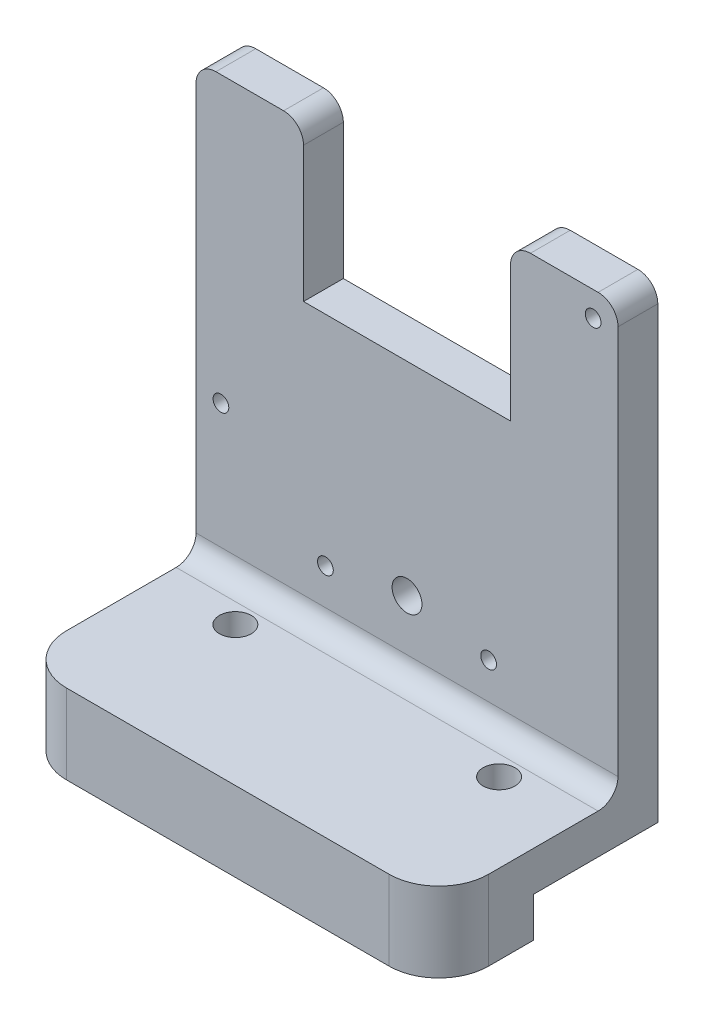
ISO-10303-21;
HEADER;
FILE_DESCRIPTION(('STEP AP214'),'2;1');
FILE_NAME('part.step','',(''),(''),'','','');
FILE_SCHEMA(('AUTOMOTIVE_DESIGN { 1 0 10303 214 1 1 1 1 }'));
ENDSEC;
DATA;
#1=APPLICATION_CONTEXT('core data for automotive mechanical design processes');
#2=APPLICATION_PROTOCOL_DEFINITION('international standard','automotive_design',2000,#1);
#3=PRODUCT_CONTEXT('',#1,'mechanical');
#4=PRODUCT('Part','Part','',(#3));
#5=PRODUCT_RELATED_PRODUCT_CATEGORY('part','',(#4));
#6=PRODUCT_DEFINITION_FORMATION('','',#4);
#7=PRODUCT_DEFINITION_CONTEXT('part definition',#1,'design');
#8=PRODUCT_DEFINITION('design','',#6,#7);
#9=PRODUCT_DEFINITION_SHAPE('','',#8);
#10=(LENGTH_UNIT() NAMED_UNIT(*) SI_UNIT(.MILLI.,.METRE.));
#11=(NAMED_UNIT(*) PLANE_ANGLE_UNIT() SI_UNIT($,.RADIAN.));
#12=(NAMED_UNIT(*) SI_UNIT($,.STERADIAN.) SOLID_ANGLE_UNIT());
#13=UNCERTAINTY_MEASURE_WITH_UNIT(LENGTH_MEASURE(1.E-05),#10,'distance_accuracy_value','');
#14=(GEOMETRIC_REPRESENTATION_CONTEXT(3) GLOBAL_UNCERTAINTY_ASSIGNED_CONTEXT((#13)) GLOBAL_UNIT_ASSIGNED_CONTEXT((#10,
#11,#12)) REPRESENTATION_CONTEXT('',''));
#15=CARTESIAN_POINT('',(0.,0.,0.));
#16=DIRECTION('',(0.,0.,1.));
#17=DIRECTION('',(1.,0.,0.));
#18=AXIS2_PLACEMENT_3D('',#15,#16,#17);
#19=CARTESIAN_POINT('',(26.924,25.4,0.));
#20=DIRECTION('',(0.,-1.,0.));
#21=DIRECTION('',(0.,0.,-1.));
#22=AXIS2_PLACEMENT_3D('',#19,#20,#21);
#23=PLANE('',#22);
#24=DIRECTION('',(-1.,0.,0.));
#25=VECTOR('',#24,1.);
#26=CARTESIAN_POINT('',(26.924,25.4,-5.08));
#27=LINE('',#26,#25);
#28=CARTESIAN_POINT('',(-15.748,25.4,-5.08));
#29=VERTEX_POINT('',#28);
#30=CARTESIAN_POINT('',(-24.384,25.4,-5.08));
#31=VERTEX_POINT('',#30);
#32=EDGE_CURVE('E257',#29,#31,#27,.T.);
#33=ORIENTED_EDGE('',*,*,#32,.T.);
#34=DIRECTION('',(0.,0.,1.));
#35=VECTOR('',#34,1.);
#36=CARTESIAN_POINT('',(-24.384,25.4,0.));
#37=LINE('',#36,#35);
#38=CARTESIAN_POINT('',(-24.384,25.4,0.));
#39=VERTEX_POINT('',#38);
#40=EDGE_CURVE('E333',#31,#39,#37,.T.);
#41=ORIENTED_EDGE('',*,*,#40,.T.);
#42=DIRECTION('',(-1.,0.,0.));
#43=VECTOR('',#42,1.);
#44=CARTESIAN_POINT('',(26.924,25.4,0.));
#45=LINE('',#44,#43);
#46=CARTESIAN_POINT('',(-15.748,25.4,0.));
#47=VERTEX_POINT('',#46);
#48=EDGE_CURVE('E241',#47,#39,#45,.T.);
#49=ORIENTED_EDGE('',*,*,#48,.F.);
#50=DIRECTION('',(0.,0.,1.));
#51=VECTOR('',#50,1.);
#52=CARTESIAN_POINT('',(-15.748,25.4,0.));
#53=LINE('',#52,#51);
#54=EDGE_CURVE('E331',#47,#29,#53,.F.);
#55=ORIENTED_EDGE('',*,*,#54,.T.);
#56=EDGE_LOOP('',(#33,#41,#49,#55));
#57=FACE_BOUND('',#56,.T.);
#58=ADVANCED_FACE('F34',(#57),#23,.F.);
#59=CARTESIAN_POINT('',(26.924,25.4,0.));
#60=DIRECTION('',(0.,0.,-1.));
#61=DIRECTION('',(0.,1.,0.));
#62=AXIS2_PLACEMENT_3D('',#59,#60,#61);
#63=PLANE('',#62);
#64=CARTESIAN_POINT('',(-23.749,-10.922,0.));
#65=DIRECTION('',(0.,0.,1.));
#66=DIRECTION('',(1.,0.,0.));
#67=AXIS2_PLACEMENT_3D('',#64,#65,#66);
#68=CIRCLE('',#67,1.0033);
#69=CARTESIAN_POINT('',(-22.7457,-10.922,0.));
#70=VERTEX_POINT('',#69);
#71=EDGE_CURVE('E206',#70,#70,#68,.T.);
#72=ORIENTED_EDGE('',*,*,#71,.F.);
#73=EDGE_LOOP('',(#72));
#74=FACE_BOUND('',#73,.T.);
#75=CARTESIAN_POINT('',(0.,-20.32,0.));
#76=DIRECTION('',(0.,0.,1.));
#77=DIRECTION('',(1.,0.,0.));
#78=AXIS2_PLACEMENT_3D('',#75,#76,#77);
#79=CIRCLE('',#78,1.905);
#80=CARTESIAN_POINT('',(1.905,-20.32,0.));
#81=VERTEX_POINT('',#80);
#82=EDGE_CURVE('E211',#81,#81,#79,.T.);
#83=ORIENTED_EDGE('',*,*,#82,.F.);
#84=EDGE_LOOP('',(#83));
#85=FACE_BOUND('',#84,.T.);
#86=CARTESIAN_POINT('',(10.414,-22.225,0.));
#87=DIRECTION('',(0.,0.,1.));
#88=DIRECTION('',(1.,0.,0.));
#89=AXIS2_PLACEMENT_3D('',#86,#87,#88);
#90=CIRCLE('',#89,1.0033);
#91=CARTESIAN_POINT('',(11.4173,-22.225,0.));
#92=VERTEX_POINT('',#91);
#93=EDGE_CURVE('E215',#92,#92,#90,.T.);
#94=ORIENTED_EDGE('',*,*,#93,.F.);
#95=EDGE_LOOP('',(#94));
#96=FACE_BOUND('',#95,.T.);
#97=CARTESIAN_POINT('',(-10.414,-22.225,0.));
#98=DIRECTION('',(0.,0.,1.));
#99=DIRECTION('',(1.,0.,0.));
#100=AXIS2_PLACEMENT_3D('',#97,#98,#99);
#101=CIRCLE('',#100,1.0033);
#102=CARTESIAN_POINT('',(-9.4107,-22.225,0.));
#103=VERTEX_POINT('',#102);
#104=EDGE_CURVE('E219',#103,#103,#101,.T.);
#105=ORIENTED_EDGE('',*,*,#104,.F.);
#106=EDGE_LOOP('',(#105));
#107=FACE_BOUND('',#106,.T.);
#108=CARTESIAN_POINT('',(23.749,22.225,0.));
#109=DIRECTION('',(0.,0.,1.));
#110=DIRECTION('',(1.,0.,0.));
#111=AXIS2_PLACEMENT_3D('',#108,#109,#110);
#112=CIRCLE('',#111,1.0033);
#113=CARTESIAN_POINT('',(24.7523,22.225,0.));
#114=VERTEX_POINT('',#113);
#115=EDGE_CURVE('E223',#114,#114,#112,.T.);
#116=ORIENTED_EDGE('',*,*,#115,.F.);
#117=EDGE_LOOP('',(#116));
#118=FACE_BOUND('',#117,.T.);
#119=DIRECTION('',(0.,-1.,0.));
#120=VECTOR('',#119,1.);
#121=CARTESIAN_POINT('',(-26.924,25.4,0.));
#122=LINE('',#121,#120);
#123=CARTESIAN_POINT('',(-26.924,22.86,0.));
#124=VERTEX_POINT('',#123);
#125=CARTESIAN_POINT('',(-26.924,-26.8478,0.));
#126=VERTEX_POINT('',#125);
#127=EDGE_CURVE('E242',#124,#126,#122,.T.);
#128=ORIENTED_EDGE('',*,*,#127,.T.);
#129=DIRECTION('',(-1.,0.,0.));
#130=VECTOR('',#129,1.);
#131=CARTESIAN_POINT('',(26.924,-26.8478,0.));
#132=LINE('',#131,#130);
#133=CARTESIAN_POINT('',(26.924,-26.8478,0.));
#134=VERTEX_POINT('',#133);
#135=EDGE_CURVE('E57',#126,#134,#132,.F.);
#136=ORIENTED_EDGE('',*,*,#135,.T.);
#137=DIRECTION('',(0.,-1.,0.));
#138=VECTOR('',#137,1.);
#139=CARTESIAN_POINT('',(26.924,25.4,0.));
#140=LINE('',#139,#138);
#141=CARTESIAN_POINT('',(26.924,22.86,0.));
#142=VERTEX_POINT('',#141);
#143=EDGE_CURVE('E227',#142,#134,#140,.T.);
#144=ORIENTED_EDGE('',*,*,#143,.F.);
#145=CARTESIAN_POINT('',(24.384,22.86,0.));
#146=DIRECTION('',(0.,0.,-1.));
#147=DIRECTION('',(0.,1.,0.));
#148=AXIS2_PLACEMENT_3D('',#145,#146,#147);
#149=CIRCLE('',#148,2.54);
#150=CARTESIAN_POINT('',(24.384,25.4,0.));
#151=VERTEX_POINT('',#150);
#152=EDGE_CURVE('E315',#142,#151,#149,.F.);
#153=ORIENTED_EDGE('',*,*,#152,.T.);
#154=CARTESIAN_POINT('',(15.748,25.4,0.));
#155=VERTEX_POINT('',#154);
#156=EDGE_CURVE('E254',#151,#155,#45,.T.);
#157=ORIENTED_EDGE('',*,*,#156,.T.);
#158=CARTESIAN_POINT('',(15.748,22.86,0.));
#159=DIRECTION('',(0.,0.,-1.));
#160=DIRECTION('',(0.,1.,0.));
#161=AXIS2_PLACEMENT_3D('',#158,#159,#160);
#162=CIRCLE('',#161,2.54);
#163=CARTESIAN_POINT('',(13.208,22.86,0.));
#164=VERTEX_POINT('',#163);
#165=EDGE_CURVE('E313',#155,#164,#162,.F.);
#166=ORIENTED_EDGE('',*,*,#165,.T.);
#167=DIRECTION('',(0.,1.,0.));
#168=VECTOR('',#167,1.);
#169=CARTESIAN_POINT('',(13.208,25.4,0.));
#170=LINE('',#169,#168);
#171=CARTESIAN_POINT('',(13.208,5.588,0.));
#172=VERTEX_POINT('',#171);
#173=EDGE_CURVE('E181',#172,#164,#170,.T.);
#174=ORIENTED_EDGE('',*,*,#173,.F.);
#175=DIRECTION('',(1.,0.,0.));
#176=VECTOR('',#175,1.);
#177=CARTESIAN_POINT('',(-13.208,5.588,0.));
#178=LINE('',#177,#176);
#179=CARTESIAN_POINT('',(-13.208,5.588,0.));
#180=VERTEX_POINT('',#179);
#181=EDGE_CURVE('E201',#180,#172,#178,.T.);
#182=ORIENTED_EDGE('',*,*,#181,.F.);
#183=DIRECTION('',(0.,-1.,0.));
#184=VECTOR('',#183,1.);
#185=CARTESIAN_POINT('',(-13.208,25.4,0.));
#186=LINE('',#185,#184);
#187=CARTESIAN_POINT('',(-13.208,22.86,0.));
#188=VERTEX_POINT('',#187);
#189=EDGE_CURVE('E187',#188,#180,#186,.T.);
#190=ORIENTED_EDGE('',*,*,#189,.F.);
#191=CARTESIAN_POINT('',(-15.748,22.86,0.));
#192=DIRECTION('',(0.,0.,-1.));
#193=DIRECTION('',(0.,1.,0.));
#194=AXIS2_PLACEMENT_3D('',#191,#192,#193);
#195=CIRCLE('',#194,2.54);
#196=EDGE_CURVE('E309',#188,#47,#195,.F.);
#197=ORIENTED_EDGE('',*,*,#196,.T.);
#198=ORIENTED_EDGE('',*,*,#48,.T.);
#199=CARTESIAN_POINT('',(-24.384,22.86,0.));
#200=DIRECTION('',(0.,0.,-1.));
#201=DIRECTION('',(0.,1.,0.));
#202=AXIS2_PLACEMENT_3D('',#199,#200,#201);
#203=CIRCLE('',#202,2.54);
#204=EDGE_CURVE('E311',#39,#124,#203,.F.);
#205=ORIENTED_EDGE('',*,*,#204,.T.);
#206=EDGE_LOOP('',(#128,#136,#144,#153,#157,#166,#174,#182,#190,#197,#198,#205));
#207=FACE_BOUND('',#206,.T.);
#208=ADVANCED_FACE('F364',(#74,#85,#96,#107,#118,#207),#63,.F.);
#209=CARTESIAN_POINT('',(26.924,-29.3878,0.));
#210=DIRECTION('',(0.,-1.,0.));
#211=DIRECTION('',(0.,0.,-1.));
#212=AXIS2_PLACEMENT_3D('',#209,#210,#211);
#213=PLANE('',#212);
#214=CARTESIAN_POINT('',(16.8275,-29.3878,5.07999999999999));
#215=DIRECTION('',(0.,1.,0.));
#216=DIRECTION('',(0.,0.,1.));
#217=AXIS2_PLACEMENT_3D('',#214,#215,#216);
#218=CIRCLE('',#217,2.032);
#219=CARTESIAN_POINT('',(16.8275,-29.3878,7.11199999999999));
#220=VERTEX_POINT('',#219);
#221=EDGE_CURVE('E352',#220,#220,#218,.T.);
#222=ORIENTED_EDGE('',*,*,#221,.F.);
#223=EDGE_LOOP('',(#222));
#224=FACE_BOUND('',#223,.T.);
#225=CARTESIAN_POINT('',(-16.8275,-29.3878,5.07999999999999));
#226=DIRECTION('',(0.,1.,0.));
#227=DIRECTION('',(0.,0.,1.));
#228=AXIS2_PLACEMENT_3D('',#225,#226,#227);
#229=CIRCLE('',#228,2.032);
#230=CARTESIAN_POINT('',(-16.8275,-29.3878,7.11199999999999));
#231=VERTEX_POINT('',#230);
#232=EDGE_CURVE('E345',#231,#231,#229,.T.);
#233=ORIENTED_EDGE('',*,*,#232,.F.);
#234=EDGE_LOOP('',(#233));
#235=FACE_BOUND('',#234,.T.);
#236=DIRECTION('',(0.,0.,1.));
#237=VECTOR('',#236,1.);
#238=CARTESIAN_POINT('',(26.924,-29.3878,0.));
#239=LINE('',#238,#237);
#240=CARTESIAN_POINT('',(26.924,-29.3878,2.53999999999999));
#241=VERTEX_POINT('',#240);
#242=CARTESIAN_POINT('',(26.924,-29.3878,16.51));
#243=VERTEX_POINT('',#242);
#244=EDGE_CURVE('E229',#241,#243,#239,.T.);
#245=ORIENTED_EDGE('',*,*,#244,.F.);
#246=DIRECTION('',(-1.,0.,0.));
#247=VECTOR('',#246,1.);
#248=CARTESIAN_POINT('',(-26.924,-29.3878,2.53999999999999));
#249=LINE('',#248,#247);
#250=CARTESIAN_POINT('',(-26.924,-29.3878,2.53999999999999));
#251=VERTEX_POINT('',#250);
#252=EDGE_CURVE('E340',#241,#251,#249,.T.);
#253=ORIENTED_EDGE('',*,*,#252,.T.);
#254=DIRECTION('',(0.,0.,1.));
#255=VECTOR('',#254,1.);
#256=CARTESIAN_POINT('',(-26.924,-29.3878,0.));
#257=LINE('',#256,#255);
#258=CARTESIAN_POINT('',(-26.924,-29.3878,16.51));
#259=VERTEX_POINT('',#258);
#260=EDGE_CURVE('E244',#251,#259,#257,.T.);
#261=ORIENTED_EDGE('',*,*,#260,.T.);
#262=CARTESIAN_POINT('',(-20.574,-29.3878,16.51));
#263=DIRECTION('',(0.,-1.,0.));
#264=DIRECTION('',(0.,0.,-1.));
#265=AXIS2_PLACEMENT_3D('',#262,#263,#264);
#266=CIRCLE('',#265,6.35);
#267=CARTESIAN_POINT('',(-20.574,-29.3878,22.86));
#268=VERTEX_POINT('',#267);
#269=EDGE_CURVE('E301',#259,#268,#266,.F.);
#270=ORIENTED_EDGE('',*,*,#269,.T.);
#271=DIRECTION('',(-1.,0.,0.));
#272=VECTOR('',#271,1.);
#273=CARTESIAN_POINT('',(26.924,-29.3878,22.86));
#274=LINE('',#273,#272);
#275=CARTESIAN_POINT('',(20.574,-29.3878,22.86));
#276=VERTEX_POINT('',#275);
#277=EDGE_CURVE('E273',#276,#268,#274,.T.);
#278=ORIENTED_EDGE('',*,*,#277,.F.);
#279=CARTESIAN_POINT('',(20.574,-29.3878,16.51));
#280=DIRECTION('',(0.,-1.,0.));
#281=DIRECTION('',(0.,0.,-1.));
#282=AXIS2_PLACEMENT_3D('',#279,#280,#281);
#283=CIRCLE('',#282,6.35);
#284=EDGE_CURVE('E298',#276,#243,#283,.F.);
#285=ORIENTED_EDGE('',*,*,#284,.T.);
#286=EDGE_LOOP('',(#245,#253,#261,#270,#278,#285));
#287=FACE_BOUND('',#286,.T.);
#288=ADVANCED_FACE('F360',(#224,#235,#287),#213,.F.);
#289=CARTESIAN_POINT('',(26.924,-29.3878,22.86));
#290=DIRECTION('',(0.,0.,-1.));
#291=DIRECTION('',(0.,1.,0.));
#292=AXIS2_PLACEMENT_3D('',#289,#290,#291);
#293=PLANE('',#292);
#294=ORIENTED_EDGE('',*,*,#277,.T.);
#295=DIRECTION('',(0.,-1.,0.));
#296=VECTOR('',#295,1.);
#297=CARTESIAN_POINT('',(-20.574,-39.5478,22.86));
#298=LINE('',#297,#296);
#299=CARTESIAN_POINT('',(-20.574,-39.5478,22.86));
#300=VERTEX_POINT('',#299);
#301=EDGE_CURVE('E288',#268,#300,#298,.T.);
#302=ORIENTED_EDGE('',*,*,#301,.T.);
#303=DIRECTION('',(-1.,0.,0.));
#304=VECTOR('',#303,1.);
#305=CARTESIAN_POINT('',(26.924,-39.5478,22.86));
#306=LINE('',#305,#304);
#307=CARTESIAN_POINT('',(20.574,-39.5478,22.86));
#308=VERTEX_POINT('',#307);
#309=EDGE_CURVE('E270',#308,#300,#306,.T.);
#310=ORIENTED_EDGE('',*,*,#309,.F.);
#311=DIRECTION('',(0.,-1.,0.));
#312=VECTOR('',#311,1.);
#313=CARTESIAN_POINT('',(20.574,-29.3878,22.86));
#314=LINE('',#313,#312);
#315=EDGE_CURVE('E276',#308,#276,#314,.F.);
#316=ORIENTED_EDGE('',*,*,#315,.T.);
#317=EDGE_LOOP('',(#294,#302,#310,#316));
#318=FACE_BOUND('',#317,.T.);
#319=ADVANCED_FACE('F363',(#318),#293,.F.);
#320=CARTESIAN_POINT('',(26.924,-39.5478,22.86));
#321=DIRECTION('',(0.,1.,0.));
#322=DIRECTION('',(0.,0.,1.));
#323=AXIS2_PLACEMENT_3D('',#320,#321,#322);
#324=PLANE('',#323);
#325=ORIENTED_EDGE('',*,*,#309,.T.);
#326=CARTESIAN_POINT('',(-20.574,-39.5478,16.51));
#327=DIRECTION('',(0.,1.,0.));
#328=DIRECTION('',(0.,0.,1.));
#329=AXIS2_PLACEMENT_3D('',#326,#327,#328);
#330=CIRCLE('',#329,6.35);
#331=CARTESIAN_POINT('',(-26.924,-39.5478,16.51));
#332=VERTEX_POINT('',#331);
#333=EDGE_CURVE('E293',#300,#332,#330,.F.);
#334=ORIENTED_EDGE('',*,*,#333,.T.);
#335=DIRECTION('',(0.,0.,-1.));
#336=VECTOR('',#335,1.);
#337=CARTESIAN_POINT('',(-26.924,-39.5478,22.86));
#338=LINE('',#337,#336);
#339=CARTESIAN_POINT('',(-26.924,-39.5478,10.795));
#340=VERTEX_POINT('',#339);
#341=EDGE_CURVE('E246',#332,#340,#338,.T.);
#342=ORIENTED_EDGE('',*,*,#341,.T.);
#343=DIRECTION('',(-1.,0.,0.));
#344=VECTOR('',#343,1.);
#345=CARTESIAN_POINT('',(26.924,-39.5478,10.795));
#346=LINE('',#345,#344);
#347=CARTESIAN_POINT('',(26.924,-39.5478,10.795));
#348=VERTEX_POINT('',#347);
#349=EDGE_CURVE('E267',#348,#340,#346,.T.);
#350=ORIENTED_EDGE('',*,*,#349,.F.);
#351=DIRECTION('',(0.,0.,-1.));
#352=VECTOR('',#351,1.);
#353=CARTESIAN_POINT('',(26.924,-39.5478,22.86));
#354=LINE('',#353,#352);
#355=CARTESIAN_POINT('',(26.924,-39.5478,16.51));
#356=VERTEX_POINT('',#355);
#357=EDGE_CURVE('E232',#356,#348,#354,.T.);
#358=ORIENTED_EDGE('',*,*,#357,.F.);
#359=CARTESIAN_POINT('',(20.574,-39.5478,16.51));
#360=DIRECTION('',(0.,1.,0.));
#361=DIRECTION('',(0.,0.,1.));
#362=AXIS2_PLACEMENT_3D('',#359,#360,#361);
#363=CIRCLE('',#362,6.35);
#364=EDGE_CURVE('E291',#356,#308,#363,.F.);
#365=ORIENTED_EDGE('',*,*,#364,.T.);
#366=EDGE_LOOP('',(#325,#334,#342,#350,#358,#365));
#367=FACE_BOUND('',#366,.T.);
#368=ADVANCED_FACE('F448',(#367),#324,.F.);
#369=CARTESIAN_POINT('',(26.924,-34.4678,10.795));
#370=DIRECTION('',(0.,0.,1.));
#371=DIRECTION('',(0.,-1.,0.));
#372=AXIS2_PLACEMENT_3D('',#369,#370,#371);
#373=PLANE('',#372);
#374=DIRECTION('',(0.,1.,0.));
#375=VECTOR('',#374,1.);
#376=CARTESIAN_POINT('',(-26.924,-34.4678,10.795));
#377=LINE('',#376,#375);
#378=CARTESIAN_POINT('',(-26.924,-34.4678,10.795));
#379=VERTEX_POINT('',#378);
#380=EDGE_CURVE('E248',#340,#379,#377,.T.);
#381=ORIENTED_EDGE('',*,*,#380,.T.);
#382=DIRECTION('',(-1.,0.,0.));
#383=VECTOR('',#382,1.);
#384=CARTESIAN_POINT('',(26.924,-34.4678,10.795));
#385=LINE('',#384,#383);
#386=CARTESIAN_POINT('',(26.924,-34.4678,10.795));
#387=VERTEX_POINT('',#386);
#388=EDGE_CURVE('E264',#387,#379,#385,.T.);
#389=ORIENTED_EDGE('',*,*,#388,.F.);
#390=DIRECTION('',(0.,1.,0.));
#391=VECTOR('',#390,1.);
#392=CARTESIAN_POINT('',(26.924,-34.4678,10.795));
#393=LINE('',#392,#391);
#394=EDGE_CURVE('E234',#348,#387,#393,.T.);
#395=ORIENTED_EDGE('',*,*,#394,.F.);
#396=ORIENTED_EDGE('',*,*,#349,.T.);
#397=EDGE_LOOP('',(#381,#389,#395,#396));
#398=FACE_BOUND('',#397,.T.);
#399=ADVANCED_FACE('F442',(#398),#373,.F.);
#400=CARTESIAN_POINT('',(26.924,-34.4678,10.795));
#401=DIRECTION('',(0.,1.,0.));
#402=DIRECTION('',(0.,0.,1.));
#403=AXIS2_PLACEMENT_3D('',#400,#401,#402);
#404=PLANE('',#403);
#405=CARTESIAN_POINT('',(16.8275,-34.4678,5.07999999999999));
#406=DIRECTION('',(0.,1.,0.));
#407=DIRECTION('',(0.,0.,1.));
#408=AXIS2_PLACEMENT_3D('',#405,#406,#407);
#409=CIRCLE('',#408,2.032);
#410=CARTESIAN_POINT('',(16.8275,-34.4678,7.11199999999999));
#411=VERTEX_POINT('',#410);
#412=EDGE_CURVE('E38',#411,#411,#409,.T.);
#413=ORIENTED_EDGE('',*,*,#412,.T.);
#414=EDGE_LOOP('',(#413));
#415=FACE_BOUND('',#414,.T.);
#416=CARTESIAN_POINT('',(-16.8275,-34.4678,5.07999999999999));
#417=DIRECTION('',(0.,1.,0.));
#418=DIRECTION('',(0.,0.,1.));
#419=AXIS2_PLACEMENT_3D('',#416,#417,#418);
#420=CIRCLE('',#419,2.032);
#421=CARTESIAN_POINT('',(-16.8275,-34.4678,7.11199999999999));
#422=VERTEX_POINT('',#421);
#423=EDGE_CURVE('E202',#422,#422,#420,.T.);
#424=ORIENTED_EDGE('',*,*,#423,.T.);
#425=EDGE_LOOP('',(#424));
#426=FACE_BOUND('',#425,.T.);
#427=DIRECTION('',(0.,0.,-1.));
#428=VECTOR('',#427,1.);
#429=CARTESIAN_POINT('',(-26.924,-34.4678,10.795));
#430=LINE('',#429,#428);
#431=CARTESIAN_POINT('',(-26.924,-34.4678,-5.08000000000001));
#432=VERTEX_POINT('',#431);
#433=EDGE_CURVE('E250',#379,#432,#430,.T.);
#434=ORIENTED_EDGE('',*,*,#433,.T.);
#435=DIRECTION('',(-1.,0.,0.));
#436=VECTOR('',#435,1.);
#437=CARTESIAN_POINT('',(26.924,-34.4678,-5.08000000000001));
#438=LINE('',#437,#436);
#439=CARTESIAN_POINT('',(26.924,-34.4678,-5.08000000000001));
#440=VERTEX_POINT('',#439);
#441=EDGE_CURVE('E261',#440,#432,#438,.T.);
#442=ORIENTED_EDGE('',*,*,#441,.F.);
#443=DIRECTION('',(0.,0.,-1.));
#444=VECTOR('',#443,1.);
#445=CARTESIAN_POINT('',(26.924,-34.4678,10.795));
#446=LINE('',#445,#444);
#447=EDGE_CURVE('E236',#387,#440,#446,.T.);
#448=ORIENTED_EDGE('',*,*,#447,.F.);
#449=ORIENTED_EDGE('',*,*,#388,.T.);
#450=EDGE_LOOP('',(#434,#442,#448,#449));
#451=FACE_BOUND('',#450,.T.);
#452=ADVANCED_FACE('F392',(#415,#426,#451),#404,.F.);
#453=CARTESIAN_POINT('',(26.924,-34.4678,-5.08000000000001));
#454=DIRECTION('',(0.,0.,1.));
#455=DIRECTION('',(0.,-1.,0.));
#456=AXIS2_PLACEMENT_3D('',#453,#454,#455);
#457=PLANE('',#456);
#458=CARTESIAN_POINT('',(24.384,25.4,-5.08));
#459=VERTEX_POINT('',#458);
#460=CARTESIAN_POINT('',(15.748,25.4,-5.08));
#461=VERTEX_POINT('',#460);
#462=EDGE_CURVE('E260',#459,#461,#27,.T.);
#463=ORIENTED_EDGE('',*,*,#462,.F.);
#464=CARTESIAN_POINT('',(24.384,22.86,-5.08));
#465=DIRECTION('',(0.,0.,1.));
#466=DIRECTION('',(0.,-1.,0.));
#467=AXIS2_PLACEMENT_3D('',#464,#465,#466);
#468=CIRCLE('',#467,2.54);
#469=CARTESIAN_POINT('',(26.924,22.86,-5.08));
#470=VERTEX_POINT('',#469);
#471=EDGE_CURVE('E327',#459,#470,#468,.F.);
#472=ORIENTED_EDGE('',*,*,#471,.T.);
#473=DIRECTION('',(0.,1.,0.));
#474=VECTOR('',#473,1.);
#475=CARTESIAN_POINT('',(26.924,-34.4678,-5.08000000000001));
#476=LINE('',#475,#474);
#477=EDGE_CURVE('E238',#440,#470,#476,.T.);
#478=ORIENTED_EDGE('',*,*,#477,.F.);
#479=ORIENTED_EDGE('',*,*,#441,.T.);
#480=DIRECTION('',(0.,1.,0.));
#481=VECTOR('',#480,1.);
#482=CARTESIAN_POINT('',(-26.924,-34.4678,-5.08000000000001));
#483=LINE('',#482,#481);
#484=CARTESIAN_POINT('',(-26.924,22.86,-5.08));
#485=VERTEX_POINT('',#484);
#486=EDGE_CURVE('E230',#432,#485,#483,.T.);
#487=ORIENTED_EDGE('',*,*,#486,.T.);
#488=CARTESIAN_POINT('',(-24.384,22.86,-5.08));
#489=DIRECTION('',(0.,0.,1.));
#490=DIRECTION('',(0.,-1.,0.));
#491=AXIS2_PLACEMENT_3D('',#488,#489,#490);
#492=CIRCLE('',#491,2.54);
#493=EDGE_CURVE('E323',#485,#31,#492,.F.);
#494=ORIENTED_EDGE('',*,*,#493,.T.);
#495=ORIENTED_EDGE('',*,*,#32,.F.);
#496=CARTESIAN_POINT('',(-15.748,22.86,-5.08));
#497=DIRECTION('',(0.,0.,1.));
#498=DIRECTION('',(0.,-1.,0.));
#499=AXIS2_PLACEMENT_3D('',#496,#497,#498);
#500=CIRCLE('',#499,2.54);
#501=CARTESIAN_POINT('',(-13.208,22.86,-5.08));
#502=VERTEX_POINT('',#501);
#503=EDGE_CURVE('E177',#29,#502,#500,.F.);
#504=ORIENTED_EDGE('',*,*,#503,.T.);
#505=DIRECTION('',(0.,-1.,0.));
#506=VECTOR('',#505,1.);
#507=CARTESIAN_POINT('',(-13.208,25.4,-5.08));
#508=LINE('',#507,#506);
#509=CARTESIAN_POINT('',(-13.208,5.588,-5.08));
#510=VERTEX_POINT('',#509);
#511=EDGE_CURVE('E167',#502,#510,#508,.T.);
#512=ORIENTED_EDGE('',*,*,#511,.T.);
#513=DIRECTION('',(1.,0.,0.));
#514=VECTOR('',#513,1.);
#515=CARTESIAN_POINT('',(-13.208,5.588,-5.08));
#516=LINE('',#515,#514);
#517=CARTESIAN_POINT('',(13.208,5.588,-5.08));
#518=VERTEX_POINT('',#517);
#519=EDGE_CURVE('E174',#510,#518,#516,.T.);
#520=ORIENTED_EDGE('',*,*,#519,.T.);
#521=DIRECTION('',(0.,1.,0.));
#522=VECTOR('',#521,1.);
#523=CARTESIAN_POINT('',(13.208,25.4,-5.08));
#524=LINE('',#523,#522);
#525=CARTESIAN_POINT('',(13.208,22.86,-5.08));
#526=VERTEX_POINT('',#525);
#527=EDGE_CURVE('E192',#518,#526,#524,.T.);
#528=ORIENTED_EDGE('',*,*,#527,.T.);
#529=CARTESIAN_POINT('',(15.748,22.86,-5.08));
#530=DIRECTION('',(0.,0.,1.));
#531=DIRECTION('',(0.,-1.,0.));
#532=AXIS2_PLACEMENT_3D('',#529,#530,#531);
#533=CIRCLE('',#532,2.54);
#534=EDGE_CURVE('E325',#526,#461,#533,.F.);
#535=ORIENTED_EDGE('',*,*,#534,.T.);
#536=EDGE_LOOP('',(#463,#472,#478,#479,#487,#494,#495,#504,#512,#520,#528,#535));
#537=FACE_BOUND('',#536,.T.);
#538=CARTESIAN_POINT('',(-23.749,-10.922,-5.08000000000001));
#539=DIRECTION('',(0.,0.,1.));
#540=DIRECTION('',(0.,-1.,0.));
#541=AXIS2_PLACEMENT_3D('',#538,#539,#540);
#542=CIRCLE('',#541,1.0033);
#543=CARTESIAN_POINT('',(-23.749,-11.9253,-5.08000000000001));
#544=VERTEX_POINT('',#543);
#545=EDGE_CURVE('E210',#544,#544,#542,.T.);
#546=ORIENTED_EDGE('',*,*,#545,.T.);
#547=EDGE_LOOP('',(#546));
#548=FACE_BOUND('',#547,.T.);
#549=CARTESIAN_POINT('',(0.,-20.32,-5.08000000000001));
#550=DIRECTION('',(0.,0.,1.));
#551=DIRECTION('',(0.,-1.,0.));
#552=AXIS2_PLACEMENT_3D('',#549,#550,#551);
#553=CIRCLE('',#552,1.905);
#554=CARTESIAN_POINT('',(0.,-22.225,-5.08000000000001));
#555=VERTEX_POINT('',#554);
#556=EDGE_CURVE('E214',#555,#555,#553,.T.);
#557=ORIENTED_EDGE('',*,*,#556,.T.);
#558=EDGE_LOOP('',(#557));
#559=FACE_BOUND('',#558,.T.);
#560=CARTESIAN_POINT('',(10.414,-22.225,-5.08000000000001));
#561=DIRECTION('',(0.,0.,1.));
#562=DIRECTION('',(0.,-1.,0.));
#563=AXIS2_PLACEMENT_3D('',#560,#561,#562);
#564=CIRCLE('',#563,1.0033);
#565=CARTESIAN_POINT('',(10.414,-23.2283,-5.08000000000001));
#566=VERTEX_POINT('',#565);
#567=EDGE_CURVE('E218',#566,#566,#564,.T.);
#568=ORIENTED_EDGE('',*,*,#567,.T.);
#569=EDGE_LOOP('',(#568));
#570=FACE_BOUND('',#569,.T.);
#571=CARTESIAN_POINT('',(-10.414,-22.225,-5.08000000000001));
#572=DIRECTION('',(0.,0.,1.));
#573=DIRECTION('',(0.,-1.,0.));
#574=AXIS2_PLACEMENT_3D('',#571,#572,#573);
#575=CIRCLE('',#574,1.0033);
#576=CARTESIAN_POINT('',(-10.414,-23.2283,-5.08000000000001));
#577=VERTEX_POINT('',#576);
#578=EDGE_CURVE('E222',#577,#577,#575,.T.);
#579=ORIENTED_EDGE('',*,*,#578,.T.);
#580=EDGE_LOOP('',(#579));
#581=FACE_BOUND('',#580,.T.);
#582=CARTESIAN_POINT('',(23.749,22.225,-5.08));
#583=DIRECTION('',(0.,0.,1.));
#584=DIRECTION('',(0.,-1.,0.));
#585=AXIS2_PLACEMENT_3D('',#582,#583,#584);
#586=CIRCLE('',#585,1.0033);
#587=CARTESIAN_POINT('',(23.749,21.2217,-5.08));
#588=VERTEX_POINT('',#587);
#589=EDGE_CURVE('E226',#588,#588,#586,.T.);
#590=ORIENTED_EDGE('',*,*,#589,.T.);
#591=EDGE_LOOP('',(#590));
#592=FACE_BOUND('',#591,.T.);
#593=ADVANCED_FACE('F170',(#537,#548,#559,#570,#581,#592),#457,.F.);
#594=ORIENTED_EDGE('',*,*,#156,.F.);
#595=DIRECTION('',(0.,0.,1.));
#596=VECTOR('',#595,1.);
#597=CARTESIAN_POINT('',(24.384,25.4,0.));
#598=LINE('',#597,#596);
#599=EDGE_CURVE('E320',#151,#459,#598,.F.);
#600=ORIENTED_EDGE('',*,*,#599,.T.);
#601=ORIENTED_EDGE('',*,*,#462,.T.);
#602=DIRECTION('',(0.,0.,1.));
#603=VECTOR('',#602,1.);
#604=CARTESIAN_POINT('',(15.748,25.4,0.));
#605=LINE('',#604,#603);
#606=EDGE_CURVE('E317',#461,#155,#605,.T.);
#607=ORIENTED_EDGE('',*,*,#606,.T.);
#608=EDGE_LOOP('',(#594,#600,#601,#607));
#609=FACE_BOUND('',#608,.T.);
#610=ADVANCED_FACE('F381',(#609),#23,.F.);
#611=CARTESIAN_POINT('',(26.924,0.,0.));
#612=DIRECTION('',(-1.,0.,0.));
#613=DIRECTION('',(0.,0.,1.));
#614=AXIS2_PLACEMENT_3D('',#611,#612,#613);
#615=PLANE('',#614);
#616=ORIENTED_EDGE('',*,*,#477,.T.);
#617=DIRECTION('',(0.,0.,1.));
#618=VECTOR('',#617,1.);
#619=CARTESIAN_POINT('',(26.924,22.86,0.));
#620=LINE('',#619,#618);
#621=EDGE_CURVE('E306',#470,#142,#620,.T.);
#622=ORIENTED_EDGE('',*,*,#621,.T.);
#623=ORIENTED_EDGE('',*,*,#143,.T.);
#624=CARTESIAN_POINT('',(26.924,-26.8478,2.53999999999999));
#625=DIRECTION('',(-1.,0.,0.));
#626=DIRECTION('',(0.,0.,1.));
#627=AXIS2_PLACEMENT_3D('',#624,#625,#626);
#628=CIRCLE('',#627,2.54);
#629=EDGE_CURVE('E11',#134,#241,#628,.T.);
#630=ORIENTED_EDGE('',*,*,#629,.T.);
#631=ORIENTED_EDGE('',*,*,#244,.T.);
#632=DIRECTION('',(0.,-1.,0.));
#633=VECTOR('',#632,1.);
#634=CARTESIAN_POINT('',(26.924,0.,16.51));
#635=LINE('',#634,#633);
#636=EDGE_CURVE('E303',#243,#356,#635,.T.);
#637=ORIENTED_EDGE('',*,*,#636,.T.);
#638=ORIENTED_EDGE('',*,*,#357,.T.);
#639=ORIENTED_EDGE('',*,*,#394,.T.);
#640=ORIENTED_EDGE('',*,*,#447,.T.);
#641=EDGE_LOOP('',(#616,#622,#623,#630,#631,#637,#638,#639,#640));
#642=FACE_BOUND('',#641,.T.);
#643=ADVANCED_FACE('F375',(#642),#615,.F.);
#644=CARTESIAN_POINT('',(-26.924,0.,0.));
#645=DIRECTION('',(-1.,0.,0.));
#646=DIRECTION('',(0.,0.,1.));
#647=AXIS2_PLACEMENT_3D('',#644,#645,#646);
#648=PLANE('',#647);
#649=ORIENTED_EDGE('',*,*,#127,.F.);
#650=DIRECTION('',(0.,0.,1.));
#651=VECTOR('',#650,1.);
#652=CARTESIAN_POINT('',(-26.924,22.86,-5.08));
#653=LINE('',#652,#651);
#654=EDGE_CURVE('E336',#124,#485,#653,.F.);
#655=ORIENTED_EDGE('',*,*,#654,.T.);
#656=ORIENTED_EDGE('',*,*,#486,.F.);
#657=ORIENTED_EDGE('',*,*,#433,.F.);
#658=ORIENTED_EDGE('',*,*,#380,.F.);
#659=ORIENTED_EDGE('',*,*,#341,.F.);
#660=DIRECTION('',(0.,-1.,0.));
#661=VECTOR('',#660,1.);
#662=CARTESIAN_POINT('',(-26.924,-29.3878,16.51));
#663=LINE('',#662,#661);
#664=EDGE_CURVE('E295',#332,#259,#663,.F.);
#665=ORIENTED_EDGE('',*,*,#664,.T.);
#666=ORIENTED_EDGE('',*,*,#260,.F.);
#667=CARTESIAN_POINT('',(-26.924,-26.8478,2.53999999999999));
#668=DIRECTION('',(-1.,0.,0.));
#669=DIRECTION('',(0.,0.,1.));
#670=AXIS2_PLACEMENT_3D('',#667,#668,#669);
#671=CIRCLE('',#670,2.54);
#672=EDGE_CURVE('E43',#251,#126,#671,.F.);
#673=ORIENTED_EDGE('',*,*,#672,.T.);
#674=EDGE_LOOP('',(#649,#655,#656,#657,#658,#659,#665,#666,#673));
#675=FACE_BOUND('',#674,.T.);
#676=ADVANCED_FACE('F396',(#675),#648,.T.);
#677=CARTESIAN_POINT('',(23.749,22.225,-51.308));
#678=DIRECTION('',(0.,0.,1.));
#679=DIRECTION('',(1.,0.,0.));
#680=AXIS2_PLACEMENT_3D('',#677,#678,#679);
#681=CYLINDRICAL_SURFACE('',#680,1.0033);
#682=ORIENTED_EDGE('',*,*,#115,.T.);
#683=EDGE_LOOP('',(#682));
#684=FACE_BOUND('',#683,.T.);
#685=ORIENTED_EDGE('',*,*,#589,.F.);
#686=EDGE_LOOP('',(#685));
#687=FACE_BOUND('',#686,.T.);
#688=ADVANCED_FACE('F526',(#684,#687),#681,.F.);
#689=CARTESIAN_POINT('',(-10.414,-22.225,-51.308));
#690=DIRECTION('',(0.,0.,1.));
#691=DIRECTION('',(1.,0.,0.));
#692=AXIS2_PLACEMENT_3D('',#689,#690,#691);
#693=CYLINDRICAL_SURFACE('',#692,1.0033);
#694=ORIENTED_EDGE('',*,*,#104,.T.);
#695=EDGE_LOOP('',(#694));
#696=FACE_BOUND('',#695,.T.);
#697=ORIENTED_EDGE('',*,*,#578,.F.);
#698=EDGE_LOOP('',(#697));
#699=FACE_BOUND('',#698,.T.);
#700=ADVANCED_FACE('F583',(#696,#699),#693,.F.);
#701=CARTESIAN_POINT('',(10.414,-22.225,-51.308));
#702=DIRECTION('',(0.,0.,1.));
#703=DIRECTION('',(1.,0.,0.));
#704=AXIS2_PLACEMENT_3D('',#701,#702,#703);
#705=CYLINDRICAL_SURFACE('',#704,1.0033);
#706=ORIENTED_EDGE('',*,*,#93,.T.);
#707=EDGE_LOOP('',(#706));
#708=FACE_BOUND('',#707,.T.);
#709=ORIENTED_EDGE('',*,*,#567,.F.);
#710=EDGE_LOOP('',(#709));
#711=FACE_BOUND('',#710,.T.);
#712=ADVANCED_FACE('F579',(#708,#711),#705,.F.);
#713=CARTESIAN_POINT('',(0.,-20.32,-51.308));
#714=DIRECTION('',(0.,0.,1.));
#715=DIRECTION('',(1.,0.,0.));
#716=AXIS2_PLACEMENT_3D('',#713,#714,#715);
#717=CYLINDRICAL_SURFACE('',#716,1.905);
#718=ORIENTED_EDGE('',*,*,#82,.T.);
#719=EDGE_LOOP('',(#718));
#720=FACE_BOUND('',#719,.T.);
#721=ORIENTED_EDGE('',*,*,#556,.F.);
#722=EDGE_LOOP('',(#721));
#723=FACE_BOUND('',#722,.T.);
#724=ADVANCED_FACE('F575',(#720,#723),#717,.F.);
#725=CARTESIAN_POINT('',(-23.749,-10.922,-51.308));
#726=DIRECTION('',(0.,0.,1.));
#727=DIRECTION('',(1.,0.,0.));
#728=AXIS2_PLACEMENT_3D('',#725,#726,#727);
#729=CYLINDRICAL_SURFACE('',#728,1.0033);
#730=ORIENTED_EDGE('',*,*,#71,.T.);
#731=EDGE_LOOP('',(#730));
#732=FACE_BOUND('',#731,.T.);
#733=ORIENTED_EDGE('',*,*,#545,.F.);
#734=EDGE_LOOP('',(#733));
#735=FACE_BOUND('',#734,.T.);
#736=ADVANCED_FACE('F572',(#732,#735),#729,.F.);
#737=CARTESIAN_POINT('',(-13.208,25.4,-5.08));
#738=DIRECTION('',(-1.,0.,0.));
#739=DIRECTION('',(0.,-1.,0.));
#740=AXIS2_PLACEMENT_3D('',#737,#738,#739);
#741=PLANE('',#740);
#742=ORIENTED_EDGE('',*,*,#511,.F.);
#743=DIRECTION('',(0.,0.,1.));
#744=VECTOR('',#743,1.);
#745=CARTESIAN_POINT('',(-13.208,22.86,-5.08));
#746=LINE('',#745,#744);
#747=EDGE_CURVE('E338',#502,#188,#746,.T.);
#748=ORIENTED_EDGE('',*,*,#747,.T.);
#749=ORIENTED_EDGE('',*,*,#189,.T.);
#750=DIRECTION('',(0.,0.,1.));
#751=VECTOR('',#750,1.);
#752=CARTESIAN_POINT('',(-13.208,5.588,-5.08));
#753=LINE('',#752,#751);
#754=EDGE_CURVE('E184',#510,#180,#753,.T.);
#755=ORIENTED_EDGE('',*,*,#754,.F.);
#756=EDGE_LOOP('',(#742,#748,#749,#755));
#757=FACE_BOUND('',#756,.T.);
#758=ADVANCED_FACE('F185',(#757),#741,.F.);
#759=CARTESIAN_POINT('',(13.208,25.4,-5.08));
#760=DIRECTION('',(1.,0.,0.));
#761=DIRECTION('',(0.,0.,-1.));
#762=AXIS2_PLACEMENT_3D('',#759,#760,#761);
#763=PLANE('',#762);
#764=ORIENTED_EDGE('',*,*,#173,.T.);
#765=DIRECTION('',(0.,0.,1.));
#766=VECTOR('',#765,1.);
#767=CARTESIAN_POINT('',(13.208,22.86,-5.08));
#768=LINE('',#767,#766);
#769=EDGE_CURVE('E329',#164,#526,#768,.F.);
#770=ORIENTED_EDGE('',*,*,#769,.T.);
#771=ORIENTED_EDGE('',*,*,#527,.F.);
#772=DIRECTION('',(0.,0.,1.));
#773=VECTOR('',#772,1.);
#774=CARTESIAN_POINT('',(13.208,5.588,-5.08));
#775=LINE('',#774,#773);
#776=EDGE_CURVE('E191',#518,#172,#775,.T.);
#777=ORIENTED_EDGE('',*,*,#776,.T.);
#778=EDGE_LOOP('',(#764,#770,#771,#777));
#779=FACE_BOUND('',#778,.T.);
#780=ADVANCED_FACE('F411',(#779),#763,.F.);
#781=CARTESIAN_POINT('',(-13.208,5.588,-5.08));
#782=DIRECTION('',(0.,-1.,0.));
#783=DIRECTION('',(0.,0.,-1.));
#784=AXIS2_PLACEMENT_3D('',#781,#782,#783);
#785=PLANE('',#784);
#786=ORIENTED_EDGE('',*,*,#181,.T.);
#787=ORIENTED_EDGE('',*,*,#776,.F.);
#788=ORIENTED_EDGE('',*,*,#519,.F.);
#789=ORIENTED_EDGE('',*,*,#754,.T.);
#790=EDGE_LOOP('',(#786,#787,#788,#789));
#791=FACE_BOUND('',#790,.T.);
#792=ADVANCED_FACE('F194',(#791),#785,.F.);
#793=CARTESIAN_POINT('',(-20.574,-29.3878,16.51));
#794=DIRECTION('',(0.,1.,0.));
#795=DIRECTION('',(0.,0.,1.));
#796=AXIS2_PLACEMENT_3D('',#793,#794,#795);
#797=CYLINDRICAL_SURFACE('',#796,6.35);
#798=ORIENTED_EDGE('',*,*,#269,.F.);
#799=ORIENTED_EDGE('',*,*,#664,.F.);
#800=ORIENTED_EDGE('',*,*,#333,.F.);
#801=ORIENTED_EDGE('',*,*,#301,.F.);
#802=EDGE_LOOP('',(#798,#799,#800,#801));
#803=FACE_BOUND('',#802,.T.);
#804=ADVANCED_FACE('F456',(#803),#797,.T.);
#805=CARTESIAN_POINT('',(20.574,0.,16.51));
#806=DIRECTION('',(0.,-1.,0.));
#807=DIRECTION('',(0.,0.,-1.));
#808=AXIS2_PLACEMENT_3D('',#805,#806,#807);
#809=CYLINDRICAL_SURFACE('',#808,6.35);
#810=ORIENTED_EDGE('',*,*,#284,.F.);
#811=ORIENTED_EDGE('',*,*,#315,.F.);
#812=ORIENTED_EDGE('',*,*,#364,.F.);
#813=ORIENTED_EDGE('',*,*,#636,.F.);
#814=EDGE_LOOP('',(#810,#811,#812,#813));
#815=FACE_BOUND('',#814,.T.);
#816=ADVANCED_FACE('F422',(#815),#809,.T.);
#817=CARTESIAN_POINT('',(24.384,22.86,0.));
#818=DIRECTION('',(0.,0.,1.));
#819=DIRECTION('',(0.,-1.,0.));
#820=AXIS2_PLACEMENT_3D('',#817,#818,#819);
#821=CYLINDRICAL_SURFACE('',#820,2.54);
#822=ORIENTED_EDGE('',*,*,#471,.F.);
#823=ORIENTED_EDGE('',*,*,#599,.F.);
#824=ORIENTED_EDGE('',*,*,#152,.F.);
#825=ORIENTED_EDGE('',*,*,#621,.F.);
#826=EDGE_LOOP('',(#822,#823,#824,#825));
#827=FACE_BOUND('',#826,.T.);
#828=ADVANCED_FACE('F385',(#827),#821,.T.);
#829=CARTESIAN_POINT('',(15.748,22.86,0.));
#830=DIRECTION('',(0.,0.,1.));
#831=DIRECTION('',(0.,-1.,0.));
#832=AXIS2_PLACEMENT_3D('',#829,#830,#831);
#833=CYLINDRICAL_SURFACE('',#832,2.54);
#834=ORIENTED_EDGE('',*,*,#534,.F.);
#835=ORIENTED_EDGE('',*,*,#769,.F.);
#836=ORIENTED_EDGE('',*,*,#165,.F.);
#837=ORIENTED_EDGE('',*,*,#606,.F.);
#838=EDGE_LOOP('',(#834,#835,#836,#837));
#839=FACE_BOUND('',#838,.T.);
#840=ADVANCED_FACE('F414',(#839),#833,.T.);
#841=CARTESIAN_POINT('',(-24.384,22.86,0.));
#842=DIRECTION('',(0.,0.,-1.));
#843=DIRECTION('',(0.,1.,0.));
#844=AXIS2_PLACEMENT_3D('',#841,#842,#843);
#845=CYLINDRICAL_SURFACE('',#844,2.54);
#846=ORIENTED_EDGE('',*,*,#493,.F.);
#847=ORIENTED_EDGE('',*,*,#654,.F.);
#848=ORIENTED_EDGE('',*,*,#204,.F.);
#849=ORIENTED_EDGE('',*,*,#40,.F.);
#850=EDGE_LOOP('',(#846,#847,#848,#849));
#851=FACE_BOUND('',#850,.T.);
#852=ADVANCED_FACE('F400',(#851),#845,.T.);
#853=CARTESIAN_POINT('',(-15.748,22.86,-5.08));
#854=DIRECTION('',(0.,0.,1.));
#855=DIRECTION('',(0.,-1.,0.));
#856=AXIS2_PLACEMENT_3D('',#853,#854,#855);
#857=CYLINDRICAL_SURFACE('',#856,2.54);
#858=ORIENTED_EDGE('',*,*,#503,.F.);
#859=ORIENTED_EDGE('',*,*,#54,.F.);
#860=ORIENTED_EDGE('',*,*,#196,.F.);
#861=ORIENTED_EDGE('',*,*,#747,.F.);
#862=EDGE_LOOP('',(#858,#859,#860,#861));
#863=FACE_BOUND('',#862,.T.);
#864=ADVANCED_FACE('F407',(#863),#857,.T.);
#865=CARTESIAN_POINT('',(26.924,-26.8478,2.53999999999999));
#866=DIRECTION('',(1.,0.,0.));
#867=DIRECTION('',(0.,0.,-1.));
#868=AXIS2_PLACEMENT_3D('',#865,#866,#867);
#869=CYLINDRICAL_SURFACE('',#868,2.54);
#870=ORIENTED_EDGE('',*,*,#629,.F.);
#871=ORIENTED_EDGE('',*,*,#135,.F.);
#872=ORIENTED_EDGE('',*,*,#672,.F.);
#873=ORIENTED_EDGE('',*,*,#252,.F.);
#874=EDGE_LOOP('',(#870,#871,#872,#873));
#875=FACE_BOUND('',#874,.T.);
#876=ADVANCED_FACE('F36',(#875),#869,.F.);
#877=CARTESIAN_POINT('',(-16.8275,-39.5478,5.07999999999999));
#878=DIRECTION('',(0.,1.,0.));
#879=DIRECTION('',(0.,0.,1.));
#880=AXIS2_PLACEMENT_3D('',#877,#878,#879);
#881=CYLINDRICAL_SURFACE('',#880,2.032);
#882=ORIENTED_EDGE('',*,*,#232,.T.);
#883=EDGE_LOOP('',(#882));
#884=FACE_BOUND('',#883,.T.);
#885=ORIENTED_EDGE('',*,*,#423,.F.);
#886=EDGE_LOOP('',(#885));
#887=FACE_BOUND('',#886,.T.);
#888=ADVANCED_FACE('F534',(#884,#887),#881,.F.);
#889=CARTESIAN_POINT('',(16.8275,-39.5478,5.07999999999999));
#890=DIRECTION('',(0.,1.,0.));
#891=DIRECTION('',(0.,0.,1.));
#892=AXIS2_PLACEMENT_3D('',#889,#890,#891);
#893=CYLINDRICAL_SURFACE('',#892,2.032);
#894=ORIENTED_EDGE('',*,*,#221,.T.);
#895=EDGE_LOOP('',(#894));
#896=FACE_BOUND('',#895,.T.);
#897=ORIENTED_EDGE('',*,*,#412,.F.);
#898=EDGE_LOOP('',(#897));
#899=FACE_BOUND('',#898,.T.);
#900=ADVANCED_FACE('F357',(#896,#899),#893,.F.);
#901=CLOSED_SHELL('',(#58,#208,#288,#319,#368,#399,#452,#593,#610,#643,#676,#688,#700,#712,#724,
#736,#758,#780,#792,#804,#816,#828,#840,#852,#864,#876,#888,#900));
#902=MANIFOLD_SOLID_BREP('B2',#901);
#903=ADVANCED_BREP_SHAPE_REPRESENTATION('',(#18,#902),#14);
#904=SHAPE_DEFINITION_REPRESENTATION(#9,#903);
ENDSEC;
END-ISO-10303-21;
